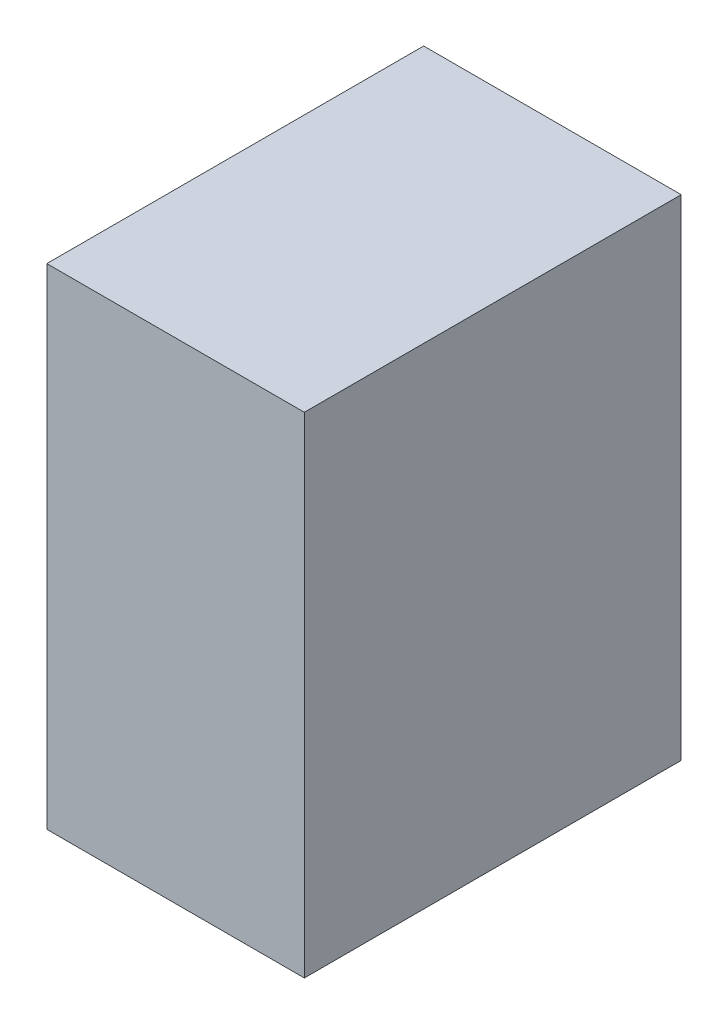
ISO-10303-21;
HEADER;
FILE_DESCRIPTION(('STEP AP214'),'2;1');
FILE_NAME('part.step','',(''),(''),'','','');
FILE_SCHEMA(('AUTOMOTIVE_DESIGN { 1 0 10303 214 1 1 1 1 }'));
ENDSEC;
DATA;
#1=APPLICATION_CONTEXT('core data for automotive mechanical design processes');
#2=APPLICATION_PROTOCOL_DEFINITION('international standard','automotive_design',2000,#1);
#3=PRODUCT_CONTEXT('',#1,'mechanical');
#4=PRODUCT('Part','Part','',(#3));
#5=PRODUCT_RELATED_PRODUCT_CATEGORY('part','',(#4));
#6=PRODUCT_DEFINITION_FORMATION('','',#4);
#7=PRODUCT_DEFINITION_CONTEXT('part definition',#1,'design');
#8=PRODUCT_DEFINITION('design','',#6,#7);
#9=PRODUCT_DEFINITION_SHAPE('','',#8);
#10=(LENGTH_UNIT() NAMED_UNIT(*) SI_UNIT(.MILLI.,.METRE.));
#11=(NAMED_UNIT(*) PLANE_ANGLE_UNIT() SI_UNIT($,.RADIAN.));
#12=(NAMED_UNIT(*) SI_UNIT($,.STERADIAN.) SOLID_ANGLE_UNIT());
#13=UNCERTAINTY_MEASURE_WITH_UNIT(LENGTH_MEASURE(1.E-05),#10,'distance_accuracy_value','');
#14=(GEOMETRIC_REPRESENTATION_CONTEXT(3) GLOBAL_UNCERTAINTY_ASSIGNED_CONTEXT((#13)) GLOBAL_UNIT_ASSIGNED_CONTEXT((#10,
#11,#12)) REPRESENTATION_CONTEXT('',''));
#15=CARTESIAN_POINT('',(0.,0.,0.));
#16=DIRECTION('',(0.,0.,1.));
#17=DIRECTION('',(1.,0.,0.));
#18=AXIS2_PLACEMENT_3D('',#15,#16,#17);
#19=CARTESIAN_POINT('',(-4.1,-7.8,12.));
#20=DIRECTION('',(0.,0.,1.));
#21=DIRECTION('',(1.,0.,0.));
#22=AXIS2_PLACEMENT_3D('',#19,#20,#21);
#23=PLANE('',#22);
#24=DIRECTION('',(0.,1.,0.));
#25=VECTOR('',#24,1.);
#26=CARTESIAN_POINT('',(-4.1,-7.8,12.));
#27=LINE('',#26,#25);
#28=CARTESIAN_POINT('',(-4.1,-7.8,12.));
#29=VERTEX_POINT('',#28);
#30=CARTESIAN_POINT('',(-4.1,7.8,12.));
#31=VERTEX_POINT('',#30);
#32=EDGE_CURVE('E89',#29,#31,#27,.T.);
#33=ORIENTED_EDGE('',*,*,#32,.F.);
#34=DIRECTION('',(1.,0.,0.));
#35=VECTOR('',#34,1.);
#36=CARTESIAN_POINT('',(-4.1,-7.8,12.));
#37=LINE('',#36,#35);
#38=CARTESIAN_POINT('',(4.1,-7.8,12.));
#39=VERTEX_POINT('',#38);
#40=EDGE_CURVE('E71',#29,#39,#37,.T.);
#41=ORIENTED_EDGE('',*,*,#40,.T.);
#42=DIRECTION('',(0.,1.,0.));
#43=VECTOR('',#42,1.);
#44=CARTESIAN_POINT('',(4.1,-7.8,12.));
#45=LINE('',#44,#43);
#46=CARTESIAN_POINT('',(4.1,7.8,12.));
#47=VERTEX_POINT('',#46);
#48=EDGE_CURVE('E83',#39,#47,#45,.T.);
#49=ORIENTED_EDGE('',*,*,#48,.T.);
#50=DIRECTION('',(1.,0.,0.));
#51=VECTOR('',#50,1.);
#52=CARTESIAN_POINT('',(-4.1,7.8,12.));
#53=LINE('',#52,#51);
#54=EDGE_CURVE('E11',#31,#47,#53,.T.);
#55=ORIENTED_EDGE('',*,*,#54,.F.);
#56=EDGE_LOOP('',(#33,#41,#49,#55));
#57=FACE_BOUND('',#56,.T.);
#58=ADVANCED_FACE('F17',(#57),#23,.T.);
#59=CARTESIAN_POINT('',(-4.1,-7.8,0.));
#60=DIRECTION('',(0.,0.,1.));
#61=DIRECTION('',(1.,0.,0.));
#62=AXIS2_PLACEMENT_3D('',#59,#60,#61);
#63=PLANE('',#62);
#64=DIRECTION('',(1.,0.,0.));
#65=VECTOR('',#64,1.);
#66=CARTESIAN_POINT('',(-4.1,7.8,0.));
#67=LINE('',#66,#65);
#68=CARTESIAN_POINT('',(-4.1,7.8,0.));
#69=VERTEX_POINT('',#68);
#70=CARTESIAN_POINT('',(4.1,7.8,0.));
#71=VERTEX_POINT('',#70);
#72=EDGE_CURVE('E26',#69,#71,#67,.T.);
#73=ORIENTED_EDGE('',*,*,#72,.T.);
#74=DIRECTION('',(0.,1.,0.));
#75=VECTOR('',#74,1.);
#76=CARTESIAN_POINT('',(4.1,-7.8,0.));
#77=LINE('',#76,#75);
#78=CARTESIAN_POINT('',(4.1,-7.8,0.));
#79=VERTEX_POINT('',#78);
#80=EDGE_CURVE('E108',#79,#71,#77,.T.);
#81=ORIENTED_EDGE('',*,*,#80,.F.);
#82=DIRECTION('',(1.,0.,0.));
#83=VECTOR('',#82,1.);
#84=CARTESIAN_POINT('',(-4.1,-7.8,0.));
#85=LINE('',#84,#83);
#86=CARTESIAN_POINT('',(-4.1,-7.8,0.));
#87=VERTEX_POINT('',#86);
#88=EDGE_CURVE('E82',#87,#79,#85,.T.);
#89=ORIENTED_EDGE('',*,*,#88,.F.);
#90=DIRECTION('',(0.,1.,0.));
#91=VECTOR('',#90,1.);
#92=CARTESIAN_POINT('',(-4.1,-7.8,0.));
#93=LINE('',#92,#91);
#94=EDGE_CURVE('E90',#87,#69,#93,.T.);
#95=ORIENTED_EDGE('',*,*,#94,.T.);
#96=EDGE_LOOP('',(#73,#81,#89,#95));
#97=FACE_BOUND('',#96,.T.);
#98=ADVANCED_FACE('F120',(#97),#63,.F.);
#99=CARTESIAN_POINT('',(-4.1,7.8,0.));
#100=DIRECTION('',(0.,1.,0.));
#101=DIRECTION('',(1.,0.,0.));
#102=AXIS2_PLACEMENT_3D('',#99,#100,#101);
#103=PLANE('',#102);
#104=ORIENTED_EDGE('',*,*,#72,.F.);
#105=DIRECTION('',(0.,0.,1.));
#106=VECTOR('',#105,1.);
#107=CARTESIAN_POINT('',(-4.1,7.8,0.));
#108=LINE('',#107,#106);
#109=EDGE_CURVE('E94',#69,#31,#108,.T.);
#110=ORIENTED_EDGE('',*,*,#109,.T.);
#111=ORIENTED_EDGE('',*,*,#54,.T.);
#112=DIRECTION('',(0.,0.,1.));
#113=VECTOR('',#112,1.);
#114=CARTESIAN_POINT('',(4.1,7.8,0.));
#115=LINE('',#114,#113);
#116=EDGE_CURVE('E104',#71,#47,#115,.T.);
#117=ORIENTED_EDGE('',*,*,#116,.F.);
#118=EDGE_LOOP('',(#104,#110,#111,#117));
#119=FACE_BOUND('',#118,.T.);
#120=ADVANCED_FACE('F19',(#119),#103,.T.);
#121=CARTESIAN_POINT('',(-4.1,-7.8,0.));
#122=DIRECTION('',(0.,1.,0.));
#123=DIRECTION('',(1.,0.,0.));
#124=AXIS2_PLACEMENT_3D('',#121,#122,#123);
#125=PLANE('',#124);
#126=DIRECTION('',(0.,0.,1.));
#127=VECTOR('',#126,1.);
#128=CARTESIAN_POINT('',(4.1,-7.8,0.));
#129=LINE('',#128,#127);
#130=EDGE_CURVE('E77',#79,#39,#129,.T.);
#131=ORIENTED_EDGE('',*,*,#130,.T.);
#132=ORIENTED_EDGE('',*,*,#40,.F.);
#133=DIRECTION('',(0.,0.,1.));
#134=VECTOR('',#133,1.);
#135=CARTESIAN_POINT('',(-4.1,-7.8,0.));
#136=LINE('',#135,#134);
#137=EDGE_CURVE('E74',#87,#29,#136,.T.);
#138=ORIENTED_EDGE('',*,*,#137,.F.);
#139=ORIENTED_EDGE('',*,*,#88,.T.);
#140=EDGE_LOOP('',(#131,#132,#138,#139));
#141=FACE_BOUND('',#140,.T.);
#142=ADVANCED_FACE('F73',(#141),#125,.F.);
#143=CARTESIAN_POINT('',(4.1,-7.8,0.));
#144=DIRECTION('',(1.,0.,0.));
#145=DIRECTION('',(0.,1.,0.));
#146=AXIS2_PLACEMENT_3D('',#143,#144,#145);
#147=PLANE('',#146);
#148=ORIENTED_EDGE('',*,*,#130,.F.);
#149=ORIENTED_EDGE('',*,*,#80,.T.);
#150=ORIENTED_EDGE('',*,*,#116,.T.);
#151=ORIENTED_EDGE('',*,*,#48,.F.);
#152=EDGE_LOOP('',(#148,#149,#150,#151));
#153=FACE_BOUND('',#152,.T.);
#154=ADVANCED_FACE('F122',(#153),#147,.T.);
#155=CARTESIAN_POINT('',(-4.1,-7.8,0.));
#156=DIRECTION('',(1.,0.,0.));
#157=DIRECTION('',(0.,1.,0.));
#158=AXIS2_PLACEMENT_3D('',#155,#156,#157);
#159=PLANE('',#158);
#160=ORIENTED_EDGE('',*,*,#32,.T.);
#161=ORIENTED_EDGE('',*,*,#109,.F.);
#162=ORIENTED_EDGE('',*,*,#94,.F.);
#163=ORIENTED_EDGE('',*,*,#137,.T.);
#164=EDGE_LOOP('',(#160,#161,#162,#163));
#165=FACE_BOUND('',#164,.T.);
#166=ADVANCED_FACE('F87',(#165),#159,.F.);
#167=CLOSED_SHELL('',(#58,#98,#120,#142,#154,#166));
#168=MANIFOLD_SOLID_BREP('B1',#167);
#169=ADVANCED_BREP_SHAPE_REPRESENTATION('',(#18,#168),#14);
#170=SHAPE_DEFINITION_REPRESENTATION(#9,#169);
ENDSEC;
END-ISO-10303-21;
